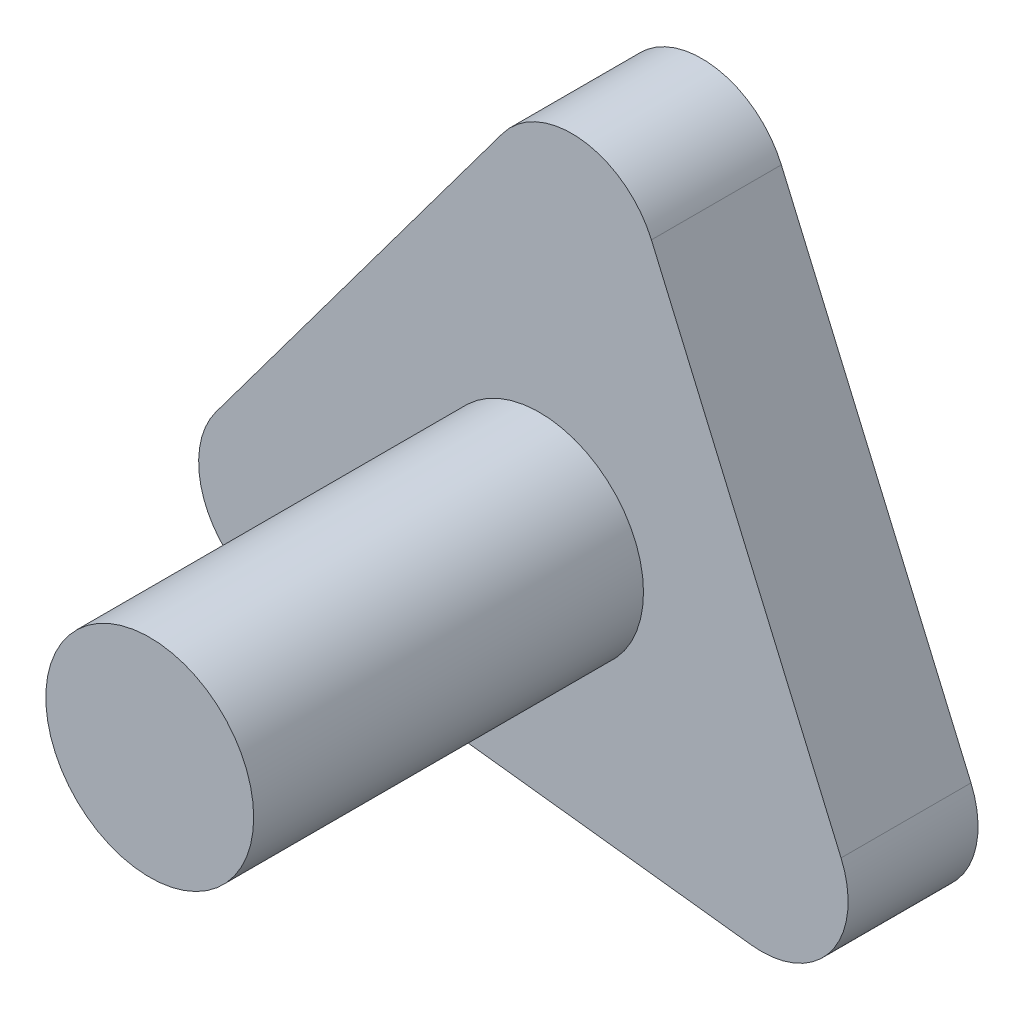
ISO-10303-21;
HEADER;
FILE_DESCRIPTION(('STEP AP214'),'2;1');
FILE_NAME('part.step','',(''),(''),'','','');
FILE_SCHEMA(('AUTOMOTIVE_DESIGN { 1 0 10303 214 1 1 1 1 }'));
ENDSEC;
DATA;
#1=APPLICATION_CONTEXT('core data for automotive mechanical design processes');
#2=APPLICATION_PROTOCOL_DEFINITION('international standard','automotive_design',2000,#1);
#3=PRODUCT_CONTEXT('',#1,'mechanical');
#4=PRODUCT('Part','Part','',(#3));
#5=PRODUCT_RELATED_PRODUCT_CATEGORY('part','',(#4));
#6=PRODUCT_DEFINITION_FORMATION('','',#4);
#7=PRODUCT_DEFINITION_CONTEXT('part definition',#1,'design');
#8=PRODUCT_DEFINITION('design','',#6,#7);
#9=PRODUCT_DEFINITION_SHAPE('','',#8);
#10=(LENGTH_UNIT() NAMED_UNIT(*) SI_UNIT(.MILLI.,.METRE.));
#11=(NAMED_UNIT(*) PLANE_ANGLE_UNIT() SI_UNIT($,.RADIAN.));
#12=(NAMED_UNIT(*) SI_UNIT($,.STERADIAN.) SOLID_ANGLE_UNIT());
#13=UNCERTAINTY_MEASURE_WITH_UNIT(LENGTH_MEASURE(1.E-05),#10,'distance_accuracy_value','');
#14=(GEOMETRIC_REPRESENTATION_CONTEXT(3) GLOBAL_UNCERTAINTY_ASSIGNED_CONTEXT((#13)) GLOBAL_UNIT_ASSIGNED_CONTEXT((#10,
#11,#12)) REPRESENTATION_CONTEXT('',''));
#15=CARTESIAN_POINT('',(0.,0.,0.));
#16=DIRECTION('',(0.,0.,1.));
#17=DIRECTION('',(1.,0.,0.));
#18=AXIS2_PLACEMENT_3D('',#15,#16,#17);
#19=CARTESIAN_POINT('',(0.,0.,9.));
#20=DIRECTION('',(0.,0.,-1.));
#21=DIRECTION('',(-1.,0.,0.));
#22=AXIS2_PLACEMENT_3D('',#19,#20,#21);
#23=CYLINDRICAL_SURFACE('',#22,2.4);
#24=CARTESIAN_POINT('',(0.,0.,9.));
#25=DIRECTION('',(0.,0.,1.));
#26=DIRECTION('',(1.,0.,0.));
#27=AXIS2_PLACEMENT_3D('',#24,#25,#26);
#28=CIRCLE('',#27,2.4);
#29=CARTESIAN_POINT('',(2.4,0.,9.));
#30=VERTEX_POINT('',#29);
#31=EDGE_CURVE('E115',#30,#30,#28,.T.);
#32=ORIENTED_EDGE('',*,*,#31,.F.);
#33=EDGE_LOOP('',(#32));
#34=FACE_BOUND('',#33,.T.);
#35=CARTESIAN_POINT('',(0.,0.,0.));
#36=DIRECTION('',(0.,0.,1.));
#37=DIRECTION('',(1.,0.,0.));
#38=AXIS2_PLACEMENT_3D('',#35,#36,#37);
#39=CIRCLE('',#38,2.4);
#40=CARTESIAN_POINT('',(2.4,0.,0.));
#41=VERTEX_POINT('',#40);
#42=EDGE_CURVE('E133',#41,#41,#39,.T.);
#43=ORIENTED_EDGE('',*,*,#42,.T.);
#44=EDGE_LOOP('',(#43));
#45=FACE_BOUND('',#44,.T.);
#46=ADVANCED_FACE('F41',(#34,#45),#23,.T.);
#47=CARTESIAN_POINT('',(0.,0.,9.));
#48=DIRECTION('',(0.,0.,1.));
#49=DIRECTION('',(1.,0.,0.));
#50=AXIS2_PLACEMENT_3D('',#47,#48,#49);
#51=PLANE('',#50);
#52=ORIENTED_EDGE('',*,*,#31,.T.);
#53=EDGE_LOOP('',(#52));
#54=FACE_BOUND('',#53,.T.);
#55=ADVANCED_FACE('F181',(#54),#51,.T.);
#56=CARTESIAN_POINT('',(8.33186545253245,-6.21128151679638,-3.));
#57=DIRECTION('',(0.116739729577086,0.993162542355615,0.));
#58=DIRECTION('',(-0.993162542355615,0.116739729577086,0.));
#59=AXIS2_PLACEMENT_3D('',#56,#57,#58);
#60=PLANE('',#59);
#61=DIRECTION('',(-0.993162542355615,0.116739729577086,0.));
#62=VECTOR('',#61,1.);
#63=CARTESIAN_POINT('',(8.33186545253245,-6.21128151679638,-3.));
#64=LINE('',#63,#62);
#65=CARTESIAN_POINT('',(4.89144948546405,-5.80688323101765,-3.));
#66=VERTEX_POINT('',#65);
#67=CARTESIAN_POINT('',(-6.10464434280022,-4.51436467018757,-3.));
#68=VERTEX_POINT('',#67);
#69=EDGE_CURVE('E125',#66,#68,#64,.T.);
#70=ORIENTED_EDGE('',*,*,#69,.F.);
#71=DIRECTION('',(0.,0.,1.));
#72=VECTOR('',#71,1.);
#73=CARTESIAN_POINT('',(4.89144948546405,-5.80688323101765,-3.));
#74=LINE('',#73,#72);
#75=CARTESIAN_POINT('',(4.89144948546405,-5.80688323101765,0.));
#76=VERTEX_POINT('',#75);
#77=EDGE_CURVE('E155',#66,#76,#74,.T.);
#78=ORIENTED_EDGE('',*,*,#77,.T.);
#79=DIRECTION('',(-0.993162542355615,0.116739729577086,0.));
#80=VECTOR('',#79,1.);
#81=CARTESIAN_POINT('',(8.33186545253245,-6.21128151679638,0.));
#82=LINE('',#81,#80);
#83=CARTESIAN_POINT('',(-6.10464434280022,-4.51436467018757,0.));
#84=VERTEX_POINT('',#83);
#85=EDGE_CURVE('E121',#76,#84,#82,.T.);
#86=ORIENTED_EDGE('',*,*,#85,.T.);
#87=DIRECTION('',(0.,0.,1.));
#88=VECTOR('',#87,1.);
#89=CARTESIAN_POINT('',(-6.10464434280022,-4.51436467018757,-3.));
#90=LINE('',#89,#88);
#91=EDGE_CURVE('E102',#84,#68,#90,.F.);
#92=ORIENTED_EDGE('',*,*,#91,.T.);
#93=EDGE_LOOP('',(#70,#78,#86,#92));
#94=FACE_BOUND('',#93,.T.);
#95=ADVANCED_FACE('F172',(#94),#60,.F.);
#96=CARTESIAN_POINT('',(-9.54506030986862,-4.10996638440884,-3.));
#97=DIRECTION('',(0.801734126978559,-0.597680842622489,0.));
#98=DIRECTION('',(0.597680842622489,0.801734126978559,0.));
#99=AXIS2_PLACEMENT_3D('',#96,#97,#98);
#100=PLANE('',#99);
#101=DIRECTION('',(0.597680842622489,0.801734126978559,0.));
#102=VECTOR('',#101,1.);
#103=CARTESIAN_POINT('',(-9.54506030986862,-4.10996638440884,0.));
#104=LINE('',#103,#102);
#105=CARTESIAN_POINT('',(-7.47463313760317,-1.33267790023136,0.));
#106=VERTEX_POINT('',#105);
#107=CARTESIAN_POINT('',(-0.85723231492928,7.54395941702773,0.));
#108=VERTEX_POINT('',#107);
#109=EDGE_CURVE('E110',#106,#108,#104,.T.);
#110=ORIENTED_EDGE('',*,*,#109,.T.);
#111=DIRECTION('',(0.,0.,1.));
#112=VECTOR('',#111,1.);
#113=CARTESIAN_POINT('',(-0.85723231492928,7.54395941702773,-3.));
#114=LINE('',#113,#112);
#115=CARTESIAN_POINT('',(-0.85723231492928,7.54395941702773,-3.));
#116=VERTEX_POINT('',#115);
#117=EDGE_CURVE('E149',#108,#116,#114,.F.);
#118=ORIENTED_EDGE('',*,*,#117,.T.);
#119=DIRECTION('',(0.597680842622489,0.801734126978559,0.));
#120=VECTOR('',#119,1.);
#121=CARTESIAN_POINT('',(-9.54506030986862,-4.10996638440884,-3.));
#122=LINE('',#121,#120);
#123=CARTESIAN_POINT('',(-7.47463313760317,-1.33267790023136,-3.));
#124=VERTEX_POINT('',#123);
#125=EDGE_CURVE('E113',#124,#116,#122,.T.);
#126=ORIENTED_EDGE('',*,*,#125,.F.);
#127=DIRECTION('',(0.,0.,1.));
#128=VECTOR('',#127,1.);
#129=CARTESIAN_POINT('',(-7.47463313760317,-1.33267790023136,-3.));
#130=LINE('',#129,#128);
#131=EDGE_CURVE('E100',#124,#106,#130,.T.);
#132=ORIENTED_EDGE('',*,*,#131,.T.);
#133=EDGE_LOOP('',(#110,#118,#126,#132));
#134=FACE_BOUND('',#133,.T.);
#135=ADVANCED_FACE('F109',(#134),#100,.F.);
#136=CARTESIAN_POINT('',(1.21319485733618,10.3212479012052,-3.));
#137=DIRECTION('',(-0.918473856555644,-0.395481699733126,0.));
#138=DIRECTION('',(0.395481699733126,-0.918473856555644,0.));
#139=AXIS2_PLACEMENT_3D('',#136,#137,#138);
#140=PLANE('',#139);
#141=DIRECTION('',(0.395481699733126,-0.918473856555644,0.));
#142=VECTOR('',#141,1.);
#143=CARTESIAN_POINT('',(1.21319485733618,10.3212479012052,0.));
#144=LINE('',#143,#142);
#145=CARTESIAN_POINT('',(2.58318365213913,7.13956113124901,0.));
#146=VERTEX_POINT('',#145);
#147=CARTESIAN_POINT('',(6.9618766577295,-3.02959474684017,0.));
#148=VERTEX_POINT('',#147);
#149=EDGE_CURVE('E120',#146,#148,#144,.T.);
#150=ORIENTED_EDGE('',*,*,#149,.T.);
#151=DIRECTION('',(0.,0.,1.));
#152=VECTOR('',#151,1.);
#153=CARTESIAN_POINT('',(6.9618766577295,-3.02959474684017,-3.));
#154=LINE('',#153,#152);
#155=CARTESIAN_POINT('',(6.9618766577295,-3.02959474684017,-3.));
#156=VERTEX_POINT('',#155);
#157=EDGE_CURVE('E50',#148,#156,#154,.F.);
#158=ORIENTED_EDGE('',*,*,#157,.T.);
#159=DIRECTION('',(0.395481699733126,-0.918473856555644,0.));
#160=VECTOR('',#159,1.);
#161=CARTESIAN_POINT('',(1.21319485733618,10.3212479012052,-3.));
#162=LINE('',#161,#160);
#163=CARTESIAN_POINT('',(2.58318365213913,7.13956113124901,-3.));
#164=VERTEX_POINT('',#163);
#165=EDGE_CURVE('E136',#164,#156,#162,.T.);
#166=ORIENTED_EDGE('',*,*,#165,.F.);
#167=DIRECTION('',(0.,0.,1.));
#168=VECTOR('',#167,1.);
#169=CARTESIAN_POINT('',(2.58318365213912,7.13956113124901,-3.));
#170=LINE('',#169,#168);
#171=EDGE_CURVE('E143',#164,#146,#170,.T.);
#172=ORIENTED_EDGE('',*,*,#171,.T.);
#173=EDGE_LOOP('',(#150,#158,#166,#172));
#174=FACE_BOUND('',#173,.T.);
#175=ADVANCED_FACE('F202',(#174),#140,.F.);
#176=CARTESIAN_POINT('',(0.,0.,-3.));
#177=DIRECTION('',(0.,0.,-1.));
#178=DIRECTION('',(-1.,0.,0.));
#179=AXIS2_PLACEMENT_3D('',#176,#177,#178);
#180=PLANE('',#179);
#181=ORIENTED_EDGE('',*,*,#165,.T.);
#182=CARTESIAN_POINT('',(5.12492894461822,-3.82055814630642,-3.));
#183=DIRECTION('',(0.,0.,-1.));
#184=DIRECTION('',(-1.,0.,0.));
#185=AXIS2_PLACEMENT_3D('',#182,#183,#184);
#186=CIRCLE('',#185,2.);
#187=EDGE_CURVE('E11',#156,#66,#186,.T.);
#188=ORIENTED_EDGE('',*,*,#187,.T.);
#189=ORIENTED_EDGE('',*,*,#69,.T.);
#190=CARTESIAN_POINT('',(-5.87116488364605,-2.52803958547634,-3.));
#191=DIRECTION('',(0.,0.,-1.));
#192=DIRECTION('',(-1.,0.,0.));
#193=AXIS2_PLACEMENT_3D('',#190,#191,#192);
#194=CIRCLE('',#193,2.);
#195=EDGE_CURVE('E140',#68,#124,#194,.T.);
#196=ORIENTED_EDGE('',*,*,#195,.T.);
#197=ORIENTED_EDGE('',*,*,#125,.T.);
#198=CARTESIAN_POINT('',(0.746235939027838,6.34859773178275,-3.));
#199=DIRECTION('',(0.,0.,-1.));
#200=DIRECTION('',(-1.,0.,0.));
#201=AXIS2_PLACEMENT_3D('',#198,#199,#200);
#202=CIRCLE('',#201,2.);
#203=EDGE_CURVE('E152',#116,#164,#202,.T.);
#204=ORIENTED_EDGE('',*,*,#203,.T.);
#205=EDGE_LOOP('',(#181,#188,#189,#196,#197,#204));
#206=FACE_BOUND('',#205,.T.);
#207=ADVANCED_FACE('F168',(#206),#180,.T.);
#208=CARTESIAN_POINT('',(0.,0.,0.));
#209=DIRECTION('',(0.,0.,-1.));
#210=DIRECTION('',(-1.,0.,0.));
#211=AXIS2_PLACEMENT_3D('',#208,#209,#210);
#212=PLANE('',#211);
#213=ORIENTED_EDGE('',*,*,#42,.F.);
#214=EDGE_LOOP('',(#213));
#215=FACE_BOUND('',#214,.T.);
#216=ORIENTED_EDGE('',*,*,#85,.F.);
#217=CARTESIAN_POINT('',(5.12492894461822,-3.82055814630642,0.));
#218=DIRECTION('',(0.,0.,-1.));
#219=DIRECTION('',(-1.,0.,0.));
#220=AXIS2_PLACEMENT_3D('',#217,#218,#219);
#221=CIRCLE('',#220,2.);
#222=EDGE_CURVE('E64',#76,#148,#221,.F.);
#223=ORIENTED_EDGE('',*,*,#222,.T.);
#224=ORIENTED_EDGE('',*,*,#149,.F.);
#225=CARTESIAN_POINT('',(0.746235939027838,6.34859773178275,0.));
#226=DIRECTION('',(0.,0.,-1.));
#227=DIRECTION('',(-1.,0.,0.));
#228=AXIS2_PLACEMENT_3D('',#225,#226,#227);
#229=CIRCLE('',#228,2.);
#230=EDGE_CURVE('E118',#146,#108,#229,.F.);
#231=ORIENTED_EDGE('',*,*,#230,.T.);
#232=ORIENTED_EDGE('',*,*,#109,.F.);
#233=CARTESIAN_POINT('',(-5.87116488364605,-2.52803958547634,0.));
#234=DIRECTION('',(0.,0.,-1.));
#235=DIRECTION('',(-1.,0.,0.));
#236=AXIS2_PLACEMENT_3D('',#233,#234,#235);
#237=CIRCLE('',#236,2.);
#238=EDGE_CURVE('E96',#106,#84,#237,.F.);
#239=ORIENTED_EDGE('',*,*,#238,.T.);
#240=EDGE_LOOP('',(#216,#223,#224,#231,#232,#239));
#241=FACE_BOUND('',#240,.T.);
#242=ADVANCED_FACE('F117',(#215,#241),#212,.F.);
#243=CARTESIAN_POINT('',(-5.87116488364605,-2.52803958547634,-3.));
#244=DIRECTION('',(0.,0.,1.));
#245=DIRECTION('',(1.,0.,0.));
#246=AXIS2_PLACEMENT_3D('',#243,#244,#245);
#247=CYLINDRICAL_SURFACE('',#246,2.);
#248=ORIENTED_EDGE('',*,*,#195,.F.);
#249=ORIENTED_EDGE('',*,*,#91,.F.);
#250=ORIENTED_EDGE('',*,*,#238,.F.);
#251=ORIENTED_EDGE('',*,*,#131,.F.);
#252=EDGE_LOOP('',(#248,#249,#250,#251));
#253=FACE_BOUND('',#252,.T.);
#254=ADVANCED_FACE('F99',(#253),#247,.T.);
#255=CARTESIAN_POINT('',(0.746235939027838,6.34859773178275,-3.));
#256=DIRECTION('',(0.,0.,1.));
#257=DIRECTION('',(1.,0.,0.));
#258=AXIS2_PLACEMENT_3D('',#255,#256,#257);
#259=CYLINDRICAL_SURFACE('',#258,2.);
#260=ORIENTED_EDGE('',*,*,#203,.F.);
#261=ORIENTED_EDGE('',*,*,#117,.F.);
#262=ORIENTED_EDGE('',*,*,#230,.F.);
#263=ORIENTED_EDGE('',*,*,#171,.F.);
#264=EDGE_LOOP('',(#260,#261,#262,#263));
#265=FACE_BOUND('',#264,.T.);
#266=ADVANCED_FACE('F175',(#265),#259,.T.);
#267=CARTESIAN_POINT('',(5.12492894461822,-3.82055814630642,-3.));
#268=DIRECTION('',(0.,0.,1.));
#269=DIRECTION('',(1.,0.,0.));
#270=AXIS2_PLACEMENT_3D('',#267,#268,#269);
#271=CYLINDRICAL_SURFACE('',#270,2.);
#272=ORIENTED_EDGE('',*,*,#187,.F.);
#273=ORIENTED_EDGE('',*,*,#157,.F.);
#274=ORIENTED_EDGE('',*,*,#222,.F.);
#275=ORIENTED_EDGE('',*,*,#77,.F.);
#276=EDGE_LOOP('',(#272,#273,#274,#275));
#277=FACE_BOUND('',#276,.T.);
#278=ADVANCED_FACE('F43',(#277),#271,.T.);
#279=CLOSED_SHELL('',(#46,#55,#95,#135,#175,#207,#242,#254,#266,#278));
#280=MANIFOLD_SOLID_BREP('B2',#279);
#281=ADVANCED_BREP_SHAPE_REPRESENTATION('',(#18,#280),#14);
#282=SHAPE_DEFINITION_REPRESENTATION(#9,#281);
ENDSEC;
END-ISO-10303-21;
